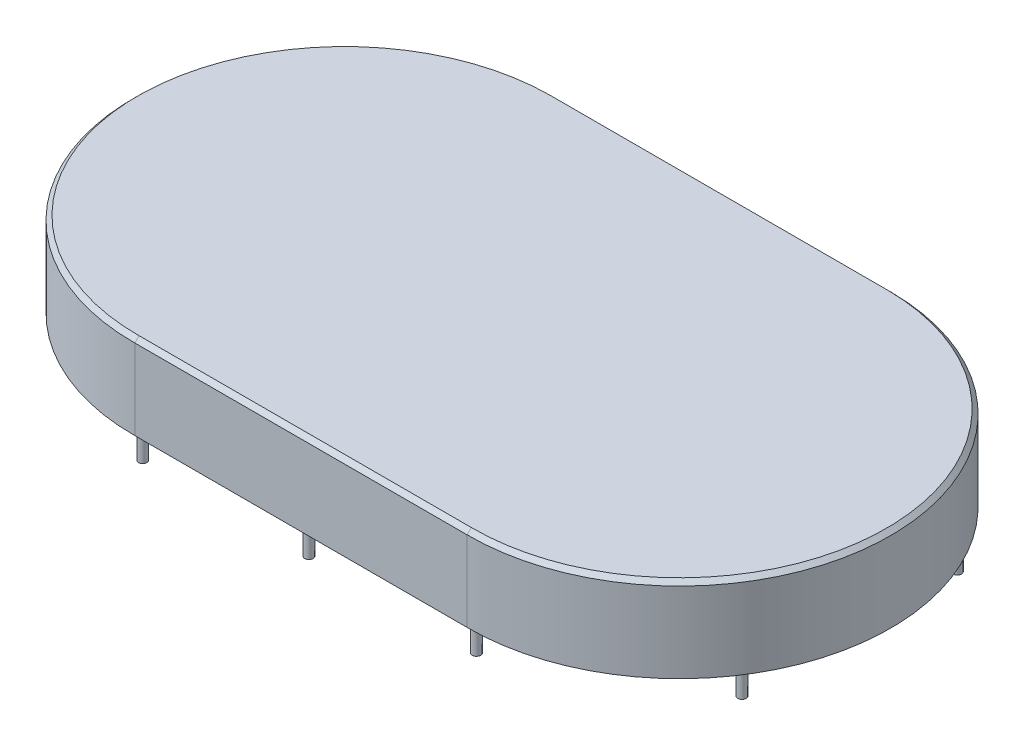
ISO-10303-21;
HEADER;
FILE_DESCRIPTION(('STEP AP214'),'2;1');
FILE_NAME('part.step','',(''),(''),'','','');
FILE_SCHEMA(('AUTOMOTIVE_DESIGN { 1 0 10303 214 1 1 1 1 }'));
ENDSEC;
DATA;
#1=APPLICATION_CONTEXT('core data for automotive mechanical design processes');
#2=APPLICATION_PROTOCOL_DEFINITION('international standard','automotive_design',2000,#1);
#3=PRODUCT_CONTEXT('',#1,'mechanical');
#4=PRODUCT('Part','Part','',(#3));
#5=PRODUCT_RELATED_PRODUCT_CATEGORY('part','',(#4));
#6=PRODUCT_DEFINITION_FORMATION('','',#4);
#7=PRODUCT_DEFINITION_CONTEXT('part definition',#1,'design');
#8=PRODUCT_DEFINITION('design','',#6,#7);
#9=PRODUCT_DEFINITION_SHAPE('','',#8);
#10=(LENGTH_UNIT() NAMED_UNIT(*) SI_UNIT(.MILLI.,.METRE.));
#11=(NAMED_UNIT(*) PLANE_ANGLE_UNIT() SI_UNIT($,.RADIAN.));
#12=(NAMED_UNIT(*) SI_UNIT($,.STERADIAN.) SOLID_ANGLE_UNIT());
#13=UNCERTAINTY_MEASURE_WITH_UNIT(LENGTH_MEASURE(1.E-05),#10,'distance_accuracy_value','');
#14=(GEOMETRIC_REPRESENTATION_CONTEXT(3) GLOBAL_UNCERTAINTY_ASSIGNED_CONTEXT((#13)) GLOBAL_UNIT_ASSIGNED_CONTEXT((#10,
#11,#12)) REPRESENTATION_CONTEXT('',''));
#15=CARTESIAN_POINT('',(0.,0.,0.));
#16=DIRECTION('',(0.,0.,1.));
#17=DIRECTION('',(1.,0.,0.));
#18=AXIS2_PLACEMENT_3D('',#15,#16,#17);
#19=CARTESIAN_POINT('',(39.6881770234131,-20.,0.));
#20=DIRECTION('',(0.,-1.,0.));
#21=DIRECTION('',(0.,0.,-1.));
#22=AXIS2_PLACEMENT_3D('',#19,#20,#21);
#23=PLANE('',#22);
#24=CARTESIAN_POINT('',(39.688177023413,-20.,-48.1069584869996));
#25=DIRECTION('',(0.,-1.,0.));
#26=DIRECTION('',(0.,0.,1.));
#27=AXIS2_PLACEMENT_3D('',#24,#25,#26);
#28=CIRCLE('',#27,0.999999999999998);
#29=CARTESIAN_POINT('',(39.688177023413,-20.,-47.1069584869996));
#30=VERTEX_POINT('',#29);
#31=EDGE_CURVE('E596',#30,#30,#28,.T.);
#32=ORIENTED_EDGE('',*,*,#31,.F.);
#33=EDGE_LOOP('',(#32));
#34=FACE_BOUND('',#33,.T.);
#35=CARTESIAN_POINT('',(-39.3729084256068,-20.,-48.1069584869996));
#36=DIRECTION('',(0.,-1.,0.));
#37=DIRECTION('',(0.,0.,1.));
#38=AXIS2_PLACEMENT_3D('',#35,#36,#37);
#39=CIRCLE('',#38,0.999999999999998);
#40=CARTESIAN_POINT('',(-39.3729084256068,-20.,-47.1069584869996));
#41=VERTEX_POINT('',#40);
#42=EDGE_CURVE('E595',#41,#41,#39,.T.);
#43=ORIENTED_EDGE('',*,*,#42,.F.);
#44=EDGE_LOOP('',(#43));
#45=FACE_BOUND('',#44,.T.);
#46=CARTESIAN_POINT('',(0.,-20.,-48.1069584869996));
#47=DIRECTION('',(0.,-1.,0.));
#48=DIRECTION('',(0.,0.,1.));
#49=AXIS2_PLACEMENT_3D('',#46,#47,#48);
#50=CIRCLE('',#49,1.);
#51=CARTESIAN_POINT('',(0.,-20.,-47.1069584869996));
#52=VERTEX_POINT('',#51);
#53=EDGE_CURVE('E605',#52,#52,#50,.T.);
#54=ORIENTED_EDGE('',*,*,#53,.F.);
#55=EDGE_LOOP('',(#54));
#56=FACE_BOUND('',#55,.T.);
#57=CARTESIAN_POINT('',(39.688177023413,-20.,48.1069584869996));
#58=DIRECTION('',(0.,-1.,0.));
#59=DIRECTION('',(0.,0.,-1.));
#60=AXIS2_PLACEMENT_3D('',#57,#58,#59);
#61=CIRCLE('',#60,0.999999999999998);
#62=CARTESIAN_POINT('',(39.688177023413,-20.,47.1069584869996));
#63=VERTEX_POINT('',#62);
#64=EDGE_CURVE('E610',#63,#63,#61,.T.);
#65=ORIENTED_EDGE('',*,*,#64,.F.);
#66=EDGE_LOOP('',(#65));
#67=FACE_BOUND('',#66,.T.);
#68=CARTESIAN_POINT('',(0.,-20.,48.1069584869996));
#69=DIRECTION('',(0.,-1.,0.));
#70=DIRECTION('',(0.,0.,-1.));
#71=AXIS2_PLACEMENT_3D('',#68,#69,#70);
#72=CIRCLE('',#71,1.);
#73=CARTESIAN_POINT('',(0.,-20.,47.1069584869996));
#74=VERTEX_POINT('',#73);
#75=EDGE_CURVE('E616',#74,#74,#72,.T.);
#76=ORIENTED_EDGE('',*,*,#75,.F.);
#77=EDGE_LOOP('',(#76));
#78=FACE_BOUND('',#77,.T.);
#79=CARTESIAN_POINT('',(-39.3729084256068,-20.,48.1069584869996));
#80=DIRECTION('',(0.,-1.,0.));
#81=DIRECTION('',(0.,0.,-1.));
#82=AXIS2_PLACEMENT_3D('',#79,#80,#81);
#83=CIRCLE('',#82,0.999999999999998);
#84=CARTESIAN_POINT('',(-39.3729084256068,-20.,47.1069584869996));
#85=VERTEX_POINT('',#84);
#86=EDGE_CURVE('E622',#85,#85,#83,.T.);
#87=ORIENTED_EDGE('',*,*,#86,.F.);
#88=EDGE_LOOP('',(#87));
#89=FACE_BOUND('',#88,.T.);
#90=CARTESIAN_POINT('',(79.9745896823286,-20.,25.5));
#91=DIRECTION('',(0.,-1.,0.));
#92=DIRECTION('',(0.,0.,-1.));
#93=AXIS2_PLACEMENT_3D('',#90,#91,#92);
#94=CIRCLE('',#93,0.999999999999998);
#95=CARTESIAN_POINT('',(79.9745896823286,-20.,24.5));
#96=VERTEX_POINT('',#95);
#97=EDGE_CURVE('E628',#96,#96,#94,.T.);
#98=ORIENTED_EDGE('',*,*,#97,.F.);
#99=EDGE_LOOP('',(#98));
#100=FACE_BOUND('',#99,.T.);
#101=CARTESIAN_POINT('',(-87.6892573834301,-20.,0.));
#102=DIRECTION('',(0.,-1.,0.));
#103=DIRECTION('',(0.,0.,-1.));
#104=AXIS2_PLACEMENT_3D('',#101,#102,#103);
#105=CIRCLE('',#104,0.999999999999998);
#106=CARTESIAN_POINT('',(-87.6892573834301,-20.,-0.999999999999998));
#107=VERTEX_POINT('',#106);
#108=EDGE_CURVE('E634',#107,#107,#105,.T.);
#109=ORIENTED_EDGE('',*,*,#108,.F.);
#110=EDGE_LOOP('',(#109));
#111=FACE_BOUND('',#110,.T.);
#112=CARTESIAN_POINT('',(-79.9745896823283,-20.,25.5));
#113=DIRECTION('',(0.,-1.,0.));
#114=DIRECTION('',(0.,0.,-1.));
#115=AXIS2_PLACEMENT_3D('',#112,#113,#114);
#116=CIRCLE('',#115,0.999999999999998);
#117=CARTESIAN_POINT('',(-79.9745896823283,-20.,24.5));
#118=VERTEX_POINT('',#117);
#119=EDGE_CURVE('E640',#118,#118,#116,.T.);
#120=ORIENTED_EDGE('',*,*,#119,.F.);
#121=EDGE_LOOP('',(#120));
#122=FACE_BOUND('',#121,.T.);
#123=CARTESIAN_POINT('',(-79.9745896823283,-20.,-25.5));
#124=DIRECTION('',(0.,-1.,0.));
#125=DIRECTION('',(0.,0.,1.));
#126=AXIS2_PLACEMENT_3D('',#123,#124,#125);
#127=CIRCLE('',#126,0.999999999999998);
#128=CARTESIAN_POINT('',(-79.9745896823283,-20.,-24.5));
#129=VERTEX_POINT('',#128);
#130=EDGE_CURVE('E646',#129,#129,#127,.T.);
#131=ORIENTED_EDGE('',*,*,#130,.F.);
#132=EDGE_LOOP('',(#131));
#133=FACE_BOUND('',#132,.T.);
#134=CARTESIAN_POINT('',(79.9745896823286,-20.,-25.5));
#135=DIRECTION('',(0.,-1.,0.));
#136=DIRECTION('',(0.,0.,1.));
#137=AXIS2_PLACEMENT_3D('',#134,#135,#136);
#138=CIRCLE('',#137,0.999999999999998);
#139=CARTESIAN_POINT('',(79.9745896823286,-20.,-24.5));
#140=VERTEX_POINT('',#139);
#141=EDGE_CURVE('E652',#140,#140,#138,.T.);
#142=ORIENTED_EDGE('',*,*,#141,.F.);
#143=EDGE_LOOP('',(#142));
#144=FACE_BOUND('',#143,.T.);
#145=CARTESIAN_POINT('',(39.6881770234131,-20.,0.));
#146=DIRECTION('',(0.,1.,0.));
#147=DIRECTION('',(0.,0.,-1.));
#148=AXIS2_PLACEMENT_3D('',#145,#146,#147);
#149=CIRCLE('',#148,50.0010803600172);
#150=CARTESIAN_POINT('',(39.3594869430936,-20.,50.));
#151=VERTEX_POINT('',#150);
#152=CARTESIAN_POINT('',(40.0168671037313,-20.,-50.));
#153=VERTEX_POINT('',#152);
#154=EDGE_CURVE('E169',#151,#153,#149,.T.);
#155=ORIENTED_EDGE('',*,*,#154,.F.);
#156=DIRECTION('',(1.,0.,0.));
#157=VECTOR('',#156,1.);
#158=CARTESIAN_POINT('',(39.3594869430936,-20.,50.));
#159=LINE('',#158,#157);
#160=CARTESIAN_POINT('',(-39.3594869430936,-20.,50.));
#161=VERTEX_POINT('',#160);
#162=EDGE_CURVE('E178',#161,#151,#159,.T.);
#163=ORIENTED_EDGE('',*,*,#162,.F.);
#164=CARTESIAN_POINT('',(-39.6881770234129,-20.,0.));
#165=DIRECTION('',(0.,1.,0.));
#166=DIRECTION('',(0.,0.,1.));
#167=AXIS2_PLACEMENT_3D('',#164,#165,#166);
#168=CIRCLE('',#167,50.0010803600172);
#169=CARTESIAN_POINT('',(-40.0168671037321,-20.,-50.));
#170=VERTEX_POINT('',#169);
#171=EDGE_CURVE('E175',#170,#161,#168,.T.);
#172=ORIENTED_EDGE('',*,*,#171,.F.);
#173=DIRECTION('',(-1.,0.,0.));
#174=VECTOR('',#173,1.);
#175=CARTESIAN_POINT('',(-40.0168671037321,-20.,-50.));
#176=LINE('',#175,#174);
#177=EDGE_CURVE('E172',#153,#170,#176,.T.);
#178=ORIENTED_EDGE('',*,*,#177,.F.);
#179=EDGE_LOOP('',(#155,#163,#172,#178));
#180=FACE_BOUND('',#179,.T.);
#181=DIRECTION('',(1.,0.,0.));
#182=VECTOR('',#181,1.);
#183=CARTESIAN_POINT('',(39.3594869430936,-20.,46.));
#184=LINE('',#183,#182);
#185=CARTESIAN_POINT('',(-39.3729084256066,-20.,46.));
#186=VERTEX_POINT('',#185);
#187=CARTESIAN_POINT('',(39.3729084256087,-20.,46.));
#188=VERTEX_POINT('',#187);
#189=EDGE_CURVE('E125',#186,#188,#184,.T.);
#190=ORIENTED_EDGE('',*,*,#189,.T.);
#191=CARTESIAN_POINT('',(39.6881770234131,-20.,0.));
#192=DIRECTION('',(0.,-1.,0.));
#193=DIRECTION('',(0.,0.,-1.));
#194=AXIS2_PLACEMENT_3D('',#191,#192,#193);
#195=CIRCLE('',#194,46.0010803600172);
#196=CARTESIAN_POINT('',(40.0034456212174,-20.,-46.));
#197=VERTEX_POINT('',#196);
#198=EDGE_CURVE('E134',#188,#197,#195,.F.);
#199=ORIENTED_EDGE('',*,*,#198,.T.);
#200=DIRECTION('',(-1.,0.,0.));
#201=VECTOR('',#200,1.);
#202=CARTESIAN_POINT('',(-40.0168671037321,-20.,-46.));
#203=LINE('',#202,#201);
#204=CARTESIAN_POINT('',(-40.0034456212192,-20.,-46.));
#205=VERTEX_POINT('',#204);
#206=EDGE_CURVE('E141',#197,#205,#203,.T.);
#207=ORIENTED_EDGE('',*,*,#206,.T.);
#208=CARTESIAN_POINT('',(-39.6881770234129,-20.,0.));
#209=DIRECTION('',(0.,-1.,0.));
#210=DIRECTION('',(0.,0.,-1.));
#211=AXIS2_PLACEMENT_3D('',#208,#209,#210);
#212=CIRCLE('',#211,46.0010803600172);
#213=EDGE_CURVE('E58',#205,#186,#212,.F.);
#214=ORIENTED_EDGE('',*,*,#213,.T.);
#215=EDGE_LOOP('',(#190,#199,#207,#214));
#216=FACE_BOUND('',#215,.T.);
#217=ADVANCED_FACE('F35',(#34,#45,#56,#67,#78,#89,#100,#111,#122,#133,#144,#180,#216),#23,.T.);
#218=CARTESIAN_POINT('',(39.6881770234131,-20.,0.));
#219=DIRECTION('',(0.,1.,0.));
#220=DIRECTION('',(0.,0.,1.));
#221=AXIS2_PLACEMENT_3D('',#218,#219,#220);
#222=CYLINDRICAL_SURFACE('',#221,50.0010803600172);
#223=DIRECTION('',(0.,1.,0.));
#224=VECTOR('',#223,1.);
#225=CARTESIAN_POINT('',(40.0168671037313,-20.,-50.));
#226=LINE('',#225,#224);
#227=CARTESIAN_POINT('',(40.0168671037313,-1.00000000000004,-50.));
#228=VERTEX_POINT('',#227);
#229=EDGE_CURVE('E181',#153,#228,#226,.T.);
#230=ORIENTED_EDGE('',*,*,#229,.T.);
#231=CARTESIAN_POINT('',(39.6881770234131,-1.00000000000004,0.));
#232=DIRECTION('',(0.,-1.,0.));
#233=DIRECTION('',(0.,0.,-1.));
#234=AXIS2_PLACEMENT_3D('',#231,#232,#233);
#235=CIRCLE('',#234,50.0010803600172);
#236=CARTESIAN_POINT('',(39.3594869430936,-1.00000000000004,50.));
#237=VERTEX_POINT('',#236);
#238=EDGE_CURVE('E11',#228,#237,#235,.T.);
#239=ORIENTED_EDGE('',*,*,#238,.T.);
#240=DIRECTION('',(0.,1.,0.));
#241=VECTOR('',#240,1.);
#242=CARTESIAN_POINT('',(39.3594869430936,-20.,50.));
#243=LINE('',#242,#241);
#244=EDGE_CURVE('E182',#151,#237,#243,.T.);
#245=ORIENTED_EDGE('',*,*,#244,.F.);
#246=ORIENTED_EDGE('',*,*,#154,.T.);
#247=EDGE_LOOP('',(#230,#239,#245,#246));
#248=FACE_BOUND('',#247,.T.);
#249=ADVANCED_FACE('F262',(#248),#222,.T.);
#250=CARTESIAN_POINT('',(39.3594869430936,-20.,50.));
#251=DIRECTION('',(0.,0.,1.));
#252=DIRECTION('',(1.,0.,0.));
#253=AXIS2_PLACEMENT_3D('',#250,#251,#252);
#254=PLANE('',#253);
#255=ORIENTED_EDGE('',*,*,#244,.T.);
#256=DIRECTION('',(-1.,0.,0.));
#257=VECTOR('',#256,1.);
#258=CARTESIAN_POINT('',(-39.3594869430936,-1.00000000000004,50.));
#259=LINE('',#258,#257);
#260=CARTESIAN_POINT('',(-39.3594869430936,-1.00000000000004,50.));
#261=VERTEX_POINT('',#260);
#262=EDGE_CURVE('E200',#237,#261,#259,.T.);
#263=ORIENTED_EDGE('',*,*,#262,.T.);
#264=DIRECTION('',(0.,1.,0.));
#265=VECTOR('',#264,1.);
#266=CARTESIAN_POINT('',(-39.3594869430936,-20.,50.));
#267=LINE('',#266,#265);
#268=EDGE_CURVE('E186',#161,#261,#267,.T.);
#269=ORIENTED_EDGE('',*,*,#268,.F.);
#270=ORIENTED_EDGE('',*,*,#162,.T.);
#271=EDGE_LOOP('',(#255,#263,#269,#270));
#272=FACE_BOUND('',#271,.T.);
#273=ADVANCED_FACE('F254',(#272),#254,.T.);
#274=CARTESIAN_POINT('',(-39.6881770234129,-20.,0.));
#275=DIRECTION('',(0.,1.,0.));
#276=DIRECTION('',(0.,0.,1.));
#277=AXIS2_PLACEMENT_3D('',#274,#275,#276);
#278=CYLINDRICAL_SURFACE('',#277,50.0010803600172);
#279=ORIENTED_EDGE('',*,*,#268,.T.);
#280=CARTESIAN_POINT('',(-39.6881770234129,-1.00000000000004,0.));
#281=DIRECTION('',(0.,-1.,0.));
#282=DIRECTION('',(0.,0.,-1.));
#283=AXIS2_PLACEMENT_3D('',#280,#281,#282);
#284=CIRCLE('',#283,50.0010803600172);
#285=CARTESIAN_POINT('',(-40.0168671037321,-1.00000000000004,-50.));
#286=VERTEX_POINT('',#285);
#287=EDGE_CURVE('E203',#261,#286,#284,.T.);
#288=ORIENTED_EDGE('',*,*,#287,.T.);
#289=DIRECTION('',(0.,1.,0.));
#290=VECTOR('',#289,1.);
#291=CARTESIAN_POINT('',(-40.0168671037321,-20.,-50.));
#292=LINE('',#291,#290);
#293=EDGE_CURVE('E189',#170,#286,#292,.T.);
#294=ORIENTED_EDGE('',*,*,#293,.F.);
#295=ORIENTED_EDGE('',*,*,#171,.T.);
#296=EDGE_LOOP('',(#279,#288,#294,#295));
#297=FACE_BOUND('',#296,.T.);
#298=ADVANCED_FACE('F255',(#297),#278,.T.);
#299=CARTESIAN_POINT('',(-40.0168671037321,-20.,-50.));
#300=DIRECTION('',(0.,0.,-1.));
#301=DIRECTION('',(-1.,0.,0.));
#302=AXIS2_PLACEMENT_3D('',#299,#300,#301);
#303=PLANE('',#302);
#304=ORIENTED_EDGE('',*,*,#293,.T.);
#305=DIRECTION('',(1.,0.,0.));
#306=VECTOR('',#305,1.);
#307=CARTESIAN_POINT('',(40.0168671037313,-1.00000000000004,-50.));
#308=LINE('',#307,#306);
#309=EDGE_CURVE('E50',#286,#228,#308,.T.);
#310=ORIENTED_EDGE('',*,*,#309,.T.);
#311=ORIENTED_EDGE('',*,*,#229,.F.);
#312=ORIENTED_EDGE('',*,*,#177,.T.);
#313=EDGE_LOOP('',(#304,#310,#311,#312));
#314=FACE_BOUND('',#313,.T.);
#315=ADVANCED_FACE('F272',(#314),#303,.T.);
#316=CARTESIAN_POINT('',(39.6881770234131,0.,0.));
#317=DIRECTION('',(0.,-1.,0.));
#318=DIRECTION('',(0.,0.,-1.));
#319=AXIS2_PLACEMENT_3D('',#316,#317,#318);
#320=PLANE('',#319);
#321=CARTESIAN_POINT('',(-39.6881770234129,0.,0.));
#322=DIRECTION('',(0.,-1.,0.));
#323=DIRECTION('',(0.,0.,-1.));
#324=AXIS2_PLACEMENT_3D('',#321,#322,#323);
#325=CIRCLE('',#324,49.0010803600172);
#326=CARTESIAN_POINT('',(-40.0135636378658,0.,-49.));
#327=VERTEX_POINT('',#326);
#328=CARTESIAN_POINT('',(-39.36279040896,0.,49.));
#329=VERTEX_POINT('',#328);
#330=EDGE_CURVE('E195',#327,#329,#325,.F.);
#331=ORIENTED_EDGE('',*,*,#330,.T.);
#332=DIRECTION('',(1.,0.,0.));
#333=VECTOR('',#332,1.);
#334=CARTESIAN_POINT('',(39.3594869430936,0.,49.));
#335=LINE('',#334,#333);
#336=CARTESIAN_POINT('',(39.3627904089621,0.,49.));
#337=VERTEX_POINT('',#336);
#338=EDGE_CURVE('E197',#329,#337,#335,.T.);
#339=ORIENTED_EDGE('',*,*,#338,.T.);
#340=CARTESIAN_POINT('',(39.6881770234131,0.,0.));
#341=DIRECTION('',(0.,-1.,0.));
#342=DIRECTION('',(0.,0.,-1.));
#343=AXIS2_PLACEMENT_3D('',#340,#341,#342);
#344=CIRCLE('',#343,49.0010803600172);
#345=CARTESIAN_POINT('',(40.013563637865,0.,-49.));
#346=VERTEX_POINT('',#345);
#347=EDGE_CURVE('E185',#337,#346,#344,.F.);
#348=ORIENTED_EDGE('',*,*,#347,.T.);
#349=DIRECTION('',(-1.,0.,0.));
#350=VECTOR('',#349,1.);
#351=CARTESIAN_POINT('',(-40.0168671037321,0.,-49.));
#352=LINE('',#351,#350);
#353=EDGE_CURVE('E193',#346,#327,#352,.T.);
#354=ORIENTED_EDGE('',*,*,#353,.T.);
#355=EDGE_LOOP('',(#331,#339,#348,#354));
#356=FACE_BOUND('',#355,.T.);
#357=ADVANCED_FACE('F265',(#356),#320,.F.);
#358=CARTESIAN_POINT('',(39.6881770234131,0.,-49.));
#359=DIRECTION('',(0.,0.707106781186543,-0.707106781186552));
#360=DIRECTION('',(1.,0.,0.));
#361=AXIS2_PLACEMENT_3D('',#358,#359,#360);
#362=PLANE('',#361);
#363=CARTESIAN_POINT('',(40.0168671037313,-1.00000000000004,-50.));
#364=CARTESIAN_POINT('',(40.0163193068082,-0.833333328740418,-49.8333333287404));
#365=CARTESIAN_POINT('',(40.0157701195245,-0.666666659777299,-49.6666666597773));
#366=CARTESIAN_POINT('',(40.0146689642358,-0.333333326443952,-49.3333333264439));
#367=CARTESIAN_POINT('',(40.0141169962309,-0.166666662073725,-49.1666666620737));
#368=CARTESIAN_POINT('',(40.0135636378654,0.,-49.));
#369=B_SPLINE_CURVE_WITH_KNOTS('',3,(#363,#364,#365,#366,#367,#368),.UNSPECIFIED.,.F.,.F.,(4,2,
4),(0.,0.707108710340045,1.41421742068059),.UNSPECIFIED.);
#370=EDGE_CURVE('E233',#228,#346,#369,.T.);
#371=ORIENTED_EDGE('',*,*,#370,.F.);
#372=ORIENTED_EDGE('',*,*,#309,.F.);
#373=CARTESIAN_POINT('',(-40.0168671037321,-1.00000000000004,-50.));
#374=CARTESIAN_POINT('',(-40.0163193068085,-0.833333328740419,-49.8333333287404));
#375=CARTESIAN_POINT('',(-40.0157701195244,-0.6666666597773,-49.6666666597773));
#376=CARTESIAN_POINT('',(-40.0146689642354,-0.333333326443953,-49.3333333264439));
#377=CARTESIAN_POINT('',(-40.0141169962305,-0.166666662073726,-49.1666666620737));
#378=CARTESIAN_POINT('',(-40.0135636378651,0.,-49.));
#379=B_SPLINE_CURVE_WITH_KNOTS('',3,(#373,#374,#375,#376,#377,#378),.UNSPECIFIED.,.F.,.F.,(4,2,
4),(0.,0.707108710340047,1.41421742068059),.UNSPECIFIED.);
#380=EDGE_CURVE('E41',#327,#286,#379,.F.);
#381=ORIENTED_EDGE('',*,*,#380,.F.);
#382=ORIENTED_EDGE('',*,*,#353,.F.);
#383=EDGE_LOOP('',(#371,#372,#381,#382));
#384=FACE_BOUND('',#383,.T.);
#385=ADVANCED_FACE('F38',(#384),#362,.T.);
#386=CARTESIAN_POINT('',(-39.6881770234129,0.,0.));
#387=DIRECTION('',(0.,-1.,0.));
#388=DIRECTION('',(0.,0.,-1.));
#389=AXIS2_PLACEMENT_3D('',#386,#387,#388);
#390=CONICAL_SURFACE('',#389,49.0010803600172,0.785398163397445);
#391=ORIENTED_EDGE('',*,*,#380,.T.);
#392=ORIENTED_EDGE('',*,*,#287,.F.);
#393=CARTESIAN_POINT('',(-39.3594869430936,-1.00000000000004,50.));
#394=CARTESIAN_POINT('',(-39.3600347400173,-0.833333328740419,49.8333333287404));
#395=CARTESIAN_POINT('',(-39.3605839273013,-0.6666666597773,49.6666666597773));
#396=CARTESIAN_POINT('',(-39.3616850825903,-0.333333326443953,49.3333333264439));
#397=CARTESIAN_POINT('',(-39.3622370505953,-0.166666662073726,49.1666666620737));
#398=CARTESIAN_POINT('',(-39.3627904089606,0.,49.));
#399=B_SPLINE_CURVE_WITH_KNOTS('',3,(#393,#394,#395,#396,#397,#398),.UNSPECIFIED.,.F.,.F.,(4,2,
4),(0.,0.707108710340047,1.41421742068059),.UNSPECIFIED.);
#400=EDGE_CURVE('E213',#329,#261,#399,.F.);
#401=ORIENTED_EDGE('',*,*,#400,.F.);
#402=ORIENTED_EDGE('',*,*,#330,.F.);
#403=EDGE_LOOP('',(#391,#392,#401,#402));
#404=FACE_BOUND('',#403,.T.);
#405=ADVANCED_FACE('F229',(#404),#390,.T.);
#406=CARTESIAN_POINT('',(39.6881770234131,0.,0.));
#407=DIRECTION('',(0.,-1.,0.));
#408=DIRECTION('',(0.,0.,-1.));
#409=AXIS2_PLACEMENT_3D('',#406,#407,#408);
#410=CONICAL_SURFACE('',#409,49.0010803600172,0.785398163397441);
#411=ORIENTED_EDGE('',*,*,#370,.T.);
#412=ORIENTED_EDGE('',*,*,#347,.F.);
#413=CARTESIAN_POINT('',(39.3627904089621,0.,49.));
#414=CARTESIAN_POINT('',(39.3622370505963,-0.166666662073722,49.1666666620737));
#415=CARTESIAN_POINT('',(39.3616850825911,-0.333333326443948,49.3333333264439));
#416=CARTESIAN_POINT('',(39.3605839273019,-0.666666659777295,49.6666666597772));
#417=CARTESIAN_POINT('',(39.3600347400179,-0.833333328740414,49.8333333287404));
#418=CARTESIAN_POINT('',(39.3594869430946,-1.00000000000004,50.));
#419=B_SPLINE_CURVE_WITH_KNOTS('',3,(#413,#414,#415,#416,#417,#418),.UNSPECIFIED.,.F.,.F.,(4,2,
4),(0.,0.707108710340538,1.41421742068059),.UNSPECIFIED.);
#420=EDGE_CURVE('E168',#237,#337,#419,.F.);
#421=ORIENTED_EDGE('',*,*,#420,.F.);
#422=ORIENTED_EDGE('',*,*,#238,.F.);
#423=EDGE_LOOP('',(#411,#412,#421,#422));
#424=FACE_BOUND('',#423,.T.);
#425=ADVANCED_FACE('F223',(#424),#410,.T.);
#426=CARTESIAN_POINT('',(39.6881770234131,0.,49.));
#427=DIRECTION('',(0.,0.707106781186543,0.707106781186552));
#428=DIRECTION('',(-1.,0.,0.));
#429=AXIS2_PLACEMENT_3D('',#426,#427,#428);
#430=PLANE('',#429);
#431=ORIENTED_EDGE('',*,*,#400,.T.);
#432=ORIENTED_EDGE('',*,*,#262,.F.);
#433=ORIENTED_EDGE('',*,*,#420,.T.);
#434=ORIENTED_EDGE('',*,*,#338,.F.);
#435=EDGE_LOOP('',(#431,#432,#433,#434));
#436=FACE_BOUND('',#435,.T.);
#437=ADVANCED_FACE('F219',(#436),#430,.T.);
#438=CARTESIAN_POINT('',(39.6881770234131,-20.,0.));
#439=DIRECTION('',(0.,1.,0.));
#440=DIRECTION('',(0.,0.,1.));
#441=AXIS2_PLACEMENT_3D('',#438,#439,#440);
#442=CYLINDRICAL_SURFACE('',#441,46.0010803600172);
#443=DIRECTION('',(0.,1.,0.));
#444=VECTOR('',#443,1.);
#445=CARTESIAN_POINT('',(40.0034456212171,-20.,-46.));
#446=LINE('',#445,#444);
#447=CARTESIAN_POINT('',(40.0034456212171,-4.,-46.));
#448=VERTEX_POINT('',#447);
#449=EDGE_CURVE('E137',#197,#448,#446,.T.);
#450=ORIENTED_EDGE('',*,*,#449,.F.);
#451=ORIENTED_EDGE('',*,*,#198,.F.);
#452=DIRECTION('',(0.,1.,0.));
#453=VECTOR('',#452,1.);
#454=CARTESIAN_POINT('',(39.3729084256091,-20.,46.));
#455=LINE('',#454,#453);
#456=CARTESIAN_POINT('',(39.3729084256091,-4.,46.));
#457=VERTEX_POINT('',#456);
#458=EDGE_CURVE('E120',#188,#457,#455,.T.);
#459=ORIENTED_EDGE('',*,*,#458,.T.);
#460=CARTESIAN_POINT('',(39.6881770234131,-4.,0.));
#461=DIRECTION('',(0.,-1.,0.));
#462=DIRECTION('',(0.,0.,-1.));
#463=AXIS2_PLACEMENT_3D('',#460,#461,#462);
#464=CIRCLE('',#463,46.0010803600172);
#465=EDGE_CURVE('E166',#448,#457,#464,.T.);
#466=ORIENTED_EDGE('',*,*,#465,.F.);
#467=EDGE_LOOP('',(#450,#451,#459,#466));
#468=FACE_BOUND('',#467,.T.);
#469=ADVANCED_FACE('F135',(#468),#442,.F.);
#470=CARTESIAN_POINT('',(39.3594869430936,-20.,46.));
#471=DIRECTION('',(0.,0.,1.));
#472=DIRECTION('',(1.,0.,0.));
#473=AXIS2_PLACEMENT_3D('',#470,#471,#472);
#474=PLANE('',#473);
#475=ORIENTED_EDGE('',*,*,#458,.F.);
#476=ORIENTED_EDGE('',*,*,#189,.F.);
#477=DIRECTION('',(0.,1.,0.));
#478=VECTOR('',#477,1.);
#479=CARTESIAN_POINT('',(-39.3729084256068,-20.,46.));
#480=LINE('',#479,#478);
#481=CARTESIAN_POINT('',(-39.3729084256068,-4.,46.));
#482=VERTEX_POINT('',#481);
#483=EDGE_CURVE('E131',#186,#482,#480,.T.);
#484=ORIENTED_EDGE('',*,*,#483,.T.);
#485=DIRECTION('',(-1.,0.,0.));
#486=VECTOR('',#485,1.);
#487=CARTESIAN_POINT('',(39.6881770234131,-4.,46.));
#488=LINE('',#487,#486);
#489=EDGE_CURVE('E127',#457,#482,#488,.T.);
#490=ORIENTED_EDGE('',*,*,#489,.F.);
#491=EDGE_LOOP('',(#475,#476,#484,#490));
#492=FACE_BOUND('',#491,.T.);
#493=ADVANCED_FACE('F122',(#492),#474,.F.);
#494=CARTESIAN_POINT('',(-39.6881770234129,-20.,0.));
#495=DIRECTION('',(0.,1.,0.));
#496=DIRECTION('',(0.,0.,1.));
#497=AXIS2_PLACEMENT_3D('',#494,#495,#496);
#498=CYLINDRICAL_SURFACE('',#497,46.0010803600172);
#499=ORIENTED_EDGE('',*,*,#483,.F.);
#500=ORIENTED_EDGE('',*,*,#213,.F.);
#501=DIRECTION('',(0.,1.,0.));
#502=VECTOR('',#501,1.);
#503=CARTESIAN_POINT('',(-40.0034456212189,-20.,-46.));
#504=LINE('',#503,#502);
#505=CARTESIAN_POINT('',(-40.0034456212189,-4.,-46.));
#506=VERTEX_POINT('',#505);
#507=EDGE_CURVE('E145',#205,#506,#504,.T.);
#508=ORIENTED_EDGE('',*,*,#507,.T.);
#509=CARTESIAN_POINT('',(-39.6881770234129,-4.,0.));
#510=DIRECTION('',(0.,-1.,0.));
#511=DIRECTION('',(0.,0.,-1.));
#512=AXIS2_PLACEMENT_3D('',#509,#510,#511);
#513=CIRCLE('',#512,46.0010803600172);
#514=EDGE_CURVE('E163',#482,#506,#513,.T.);
#515=ORIENTED_EDGE('',*,*,#514,.F.);
#516=EDGE_LOOP('',(#499,#500,#508,#515));
#517=FACE_BOUND('',#516,.T.);
#518=ADVANCED_FACE('F340',(#517),#498,.F.);
#519=CARTESIAN_POINT('',(-40.0168671037321,-20.,-46.));
#520=DIRECTION('',(0.,0.,-1.));
#521=DIRECTION('',(-1.,0.,0.));
#522=AXIS2_PLACEMENT_3D('',#519,#520,#521);
#523=PLANE('',#522);
#524=DIRECTION('',(-1.,0.,0.));
#525=VECTOR('',#524,1.);
#526=CARTESIAN_POINT('',(-40.0168671037321,-4.,-46.));
#527=LINE('',#526,#525);
#528=EDGE_CURVE('E130',#448,#506,#527,.T.);
#529=ORIENTED_EDGE('',*,*,#528,.T.);
#530=ORIENTED_EDGE('',*,*,#507,.F.);
#531=ORIENTED_EDGE('',*,*,#206,.F.);
#532=ORIENTED_EDGE('',*,*,#449,.T.);
#533=EDGE_LOOP('',(#529,#530,#531,#532));
#534=FACE_BOUND('',#533,.T.);
#535=ADVANCED_FACE('F349',(#534),#523,.F.);
#536=CARTESIAN_POINT('',(39.6881770234131,-4.,0.));
#537=DIRECTION('',(0.,-1.,0.));
#538=DIRECTION('',(0.,0.,-1.));
#539=AXIS2_PLACEMENT_3D('',#536,#537,#538);
#540=PLANE('',#539);
#541=ORIENTED_EDGE('',*,*,#465,.T.);
#542=ORIENTED_EDGE('',*,*,#489,.T.);
#543=ORIENTED_EDGE('',*,*,#514,.T.);
#544=ORIENTED_EDGE('',*,*,#528,.F.);
#545=EDGE_LOOP('',(#541,#542,#543,#544));
#546=FACE_BOUND('',#545,.T.);
#547=ADVANCED_FACE('F283',(#546),#540,.T.);
#548=CARTESIAN_POINT('',(79.9745896823286,-26.,-25.5));
#549=DIRECTION('',(0.,1.,0.));
#550=DIRECTION('',(0.,0.,1.));
#551=AXIS2_PLACEMENT_3D('',#548,#549,#550);
#552=CYLINDRICAL_SURFACE('',#551,0.999999999999998);
#553=CARTESIAN_POINT('',(79.9745896823286,-26.,-25.5));
#554=DIRECTION('',(0.,-1.,0.));
#555=DIRECTION('',(0.,0.,1.));
#556=AXIS2_PLACEMENT_3D('',#553,#554,#555);
#557=CIRCLE('',#556,0.999999999999998);
#558=CARTESIAN_POINT('',(79.9745896823286,-26.,-24.5));
#559=VERTEX_POINT('',#558);
#560=EDGE_CURVE('E142',#559,#559,#557,.T.);
#561=ORIENTED_EDGE('',*,*,#560,.F.);
#562=EDGE_LOOP('',(#561));
#563=FACE_BOUND('',#562,.T.);
#564=ORIENTED_EDGE('',*,*,#141,.T.);
#565=EDGE_LOOP('',(#564));
#566=FACE_BOUND('',#565,.T.);
#567=ADVANCED_FACE('F365',(#563,#566),#552,.T.);
#568=CARTESIAN_POINT('',(79.9745896823286,-26.,-25.5));
#569=DIRECTION('',(0.,1.,0.));
#570=DIRECTION('',(0.,0.,1.));
#571=AXIS2_PLACEMENT_3D('',#568,#569,#570);
#572=PLANE('',#571);
#573=ORIENTED_EDGE('',*,*,#560,.T.);
#574=EDGE_LOOP('',(#573));
#575=FACE_BOUND('',#574,.T.);
#576=ADVANCED_FACE('F378',(#575),#572,.F.);
#577=CARTESIAN_POINT('',(-79.9745896823283,-26.,-25.5));
#578=DIRECTION('',(0.,1.,0.));
#579=DIRECTION('',(0.,0.,1.));
#580=AXIS2_PLACEMENT_3D('',#577,#578,#579);
#581=CYLINDRICAL_SURFACE('',#580,0.999999999999998);
#582=CARTESIAN_POINT('',(-79.9745896823283,-26.,-25.5));
#583=DIRECTION('',(0.,-1.,0.));
#584=DIRECTION('',(0.,0.,1.));
#585=AXIS2_PLACEMENT_3D('',#582,#583,#584);
#586=CIRCLE('',#585,0.999999999999998);
#587=CARTESIAN_POINT('',(-79.9745896823283,-26.,-24.5));
#588=VERTEX_POINT('',#587);
#589=EDGE_CURVE('E649',#588,#588,#586,.T.);
#590=ORIENTED_EDGE('',*,*,#589,.F.);
#591=EDGE_LOOP('',(#590));
#592=FACE_BOUND('',#591,.T.);
#593=ORIENTED_EDGE('',*,*,#130,.T.);
#594=EDGE_LOOP('',(#593));
#595=FACE_BOUND('',#594,.T.);
#596=ADVANCED_FACE('F388',(#592,#595),#581,.T.);
#597=CARTESIAN_POINT('',(-79.9745896823283,-26.,-25.5));
#598=DIRECTION('',(0.,1.,0.));
#599=DIRECTION('',(0.,0.,1.));
#600=AXIS2_PLACEMENT_3D('',#597,#598,#599);
#601=PLANE('',#600);
#602=ORIENTED_EDGE('',*,*,#589,.T.);
#603=EDGE_LOOP('',(#602));
#604=FACE_BOUND('',#603,.T.);
#605=ADVANCED_FACE('F398',(#604),#601,.F.);
#606=CARTESIAN_POINT('',(-79.9745896823283,-26.,25.5));
#607=DIRECTION('',(0.,1.,0.));
#608=DIRECTION('',(0.,0.,1.));
#609=AXIS2_PLACEMENT_3D('',#606,#607,#608);
#610=CYLINDRICAL_SURFACE('',#609,0.999999999999998);
#611=CARTESIAN_POINT('',(-79.9745896823283,-26.,25.5));
#612=DIRECTION('',(0.,-1.,0.));
#613=DIRECTION('',(0.,0.,-1.));
#614=AXIS2_PLACEMENT_3D('',#611,#612,#613);
#615=CIRCLE('',#614,0.999999999999998);
#616=CARTESIAN_POINT('',(-79.9745896823283,-26.,24.5));
#617=VERTEX_POINT('',#616);
#618=EDGE_CURVE('E643',#617,#617,#615,.T.);
#619=ORIENTED_EDGE('',*,*,#618,.F.);
#620=EDGE_LOOP('',(#619));
#621=FACE_BOUND('',#620,.T.);
#622=ORIENTED_EDGE('',*,*,#119,.T.);
#623=EDGE_LOOP('',(#622));
#624=FACE_BOUND('',#623,.T.);
#625=ADVANCED_FACE('F408',(#621,#624),#610,.T.);
#626=CARTESIAN_POINT('',(-79.9745896823283,-26.,25.5));
#627=DIRECTION('',(0.,-1.,0.));
#628=DIRECTION('',(0.,0.,-1.));
#629=AXIS2_PLACEMENT_3D('',#626,#627,#628);
#630=PLANE('',#629);
#631=ORIENTED_EDGE('',*,*,#618,.T.);
#632=EDGE_LOOP('',(#631));
#633=FACE_BOUND('',#632,.T.);
#634=ADVANCED_FACE('F418',(#633),#630,.T.);
#635=CARTESIAN_POINT('',(-87.6892573834301,-26.,0.));
#636=DIRECTION('',(0.,1.,0.));
#637=DIRECTION('',(0.,0.,1.));
#638=AXIS2_PLACEMENT_3D('',#635,#636,#637);
#639=CYLINDRICAL_SURFACE('',#638,0.999999999999998);
#640=CARTESIAN_POINT('',(-87.6892573834301,-26.,0.));
#641=DIRECTION('',(0.,-1.,0.));
#642=DIRECTION('',(0.,0.,-1.));
#643=AXIS2_PLACEMENT_3D('',#640,#641,#642);
#644=CIRCLE('',#643,0.999999999999998);
#645=CARTESIAN_POINT('',(-87.6892573834301,-26.,-0.999999999999998));
#646=VERTEX_POINT('',#645);
#647=EDGE_CURVE('E637',#646,#646,#644,.T.);
#648=ORIENTED_EDGE('',*,*,#647,.F.);
#649=EDGE_LOOP('',(#648));
#650=FACE_BOUND('',#649,.T.);
#651=ORIENTED_EDGE('',*,*,#108,.T.);
#652=EDGE_LOOP('',(#651));
#653=FACE_BOUND('',#652,.T.);
#654=ADVANCED_FACE('F428',(#650,#653),#639,.T.);
#655=CARTESIAN_POINT('',(-87.6892573834301,-26.,0.));
#656=DIRECTION('',(0.,-1.,0.));
#657=DIRECTION('',(0.,0.,-1.));
#658=AXIS2_PLACEMENT_3D('',#655,#656,#657);
#659=PLANE('',#658);
#660=ORIENTED_EDGE('',*,*,#647,.T.);
#661=EDGE_LOOP('',(#660));
#662=FACE_BOUND('',#661,.T.);
#663=ADVANCED_FACE('F438',(#662),#659,.T.);
#664=CARTESIAN_POINT('',(79.9745896823286,-26.,25.5));
#665=DIRECTION('',(0.,1.,0.));
#666=DIRECTION('',(0.,0.,1.));
#667=AXIS2_PLACEMENT_3D('',#664,#665,#666);
#668=CYLINDRICAL_SURFACE('',#667,0.999999999999998);
#669=CARTESIAN_POINT('',(79.9745896823286,-26.,25.5));
#670=DIRECTION('',(0.,-1.,0.));
#671=DIRECTION('',(0.,0.,-1.));
#672=AXIS2_PLACEMENT_3D('',#669,#670,#671);
#673=CIRCLE('',#672,0.999999999999998);
#674=CARTESIAN_POINT('',(79.9745896823286,-26.,24.5));
#675=VERTEX_POINT('',#674);
#676=EDGE_CURVE('E631',#675,#675,#673,.T.);
#677=ORIENTED_EDGE('',*,*,#676,.F.);
#678=EDGE_LOOP('',(#677));
#679=FACE_BOUND('',#678,.T.);
#680=ORIENTED_EDGE('',*,*,#97,.T.);
#681=EDGE_LOOP('',(#680));
#682=FACE_BOUND('',#681,.T.);
#683=ADVANCED_FACE('F448',(#679,#682),#668,.T.);
#684=CARTESIAN_POINT('',(79.9745896823286,-26.,25.5));
#685=DIRECTION('',(0.,-1.,0.));
#686=DIRECTION('',(0.,0.,-1.));
#687=AXIS2_PLACEMENT_3D('',#684,#685,#686);
#688=PLANE('',#687);
#689=ORIENTED_EDGE('',*,*,#676,.T.);
#690=EDGE_LOOP('',(#689));
#691=FACE_BOUND('',#690,.T.);
#692=ADVANCED_FACE('F458',(#691),#688,.T.);
#693=CARTESIAN_POINT('',(-39.3729084256068,-26.,48.1069584869996));
#694=DIRECTION('',(0.,1.,0.));
#695=DIRECTION('',(0.,0.,1.));
#696=AXIS2_PLACEMENT_3D('',#693,#694,#695);
#697=CYLINDRICAL_SURFACE('',#696,0.999999999999998);
#698=CARTESIAN_POINT('',(-39.3729084256068,-26.,48.1069584869996));
#699=DIRECTION('',(0.,-1.,0.));
#700=DIRECTION('',(0.,0.,-1.));
#701=AXIS2_PLACEMENT_3D('',#698,#699,#700);
#702=CIRCLE('',#701,0.999999999999998);
#703=CARTESIAN_POINT('',(-39.3729084256068,-26.,47.1069584869996));
#704=VERTEX_POINT('',#703);
#705=EDGE_CURVE('E625',#704,#704,#702,.T.);
#706=ORIENTED_EDGE('',*,*,#705,.F.);
#707=EDGE_LOOP('',(#706));
#708=FACE_BOUND('',#707,.T.);
#709=ORIENTED_EDGE('',*,*,#86,.T.);
#710=EDGE_LOOP('',(#709));
#711=FACE_BOUND('',#710,.T.);
#712=ADVANCED_FACE('F468',(#708,#711),#697,.T.);
#713=CARTESIAN_POINT('',(-39.3729084256068,-26.,48.1069584869996));
#714=DIRECTION('',(0.,-1.,0.));
#715=DIRECTION('',(0.,0.,-1.));
#716=AXIS2_PLACEMENT_3D('',#713,#714,#715);
#717=PLANE('',#716);
#718=ORIENTED_EDGE('',*,*,#705,.T.);
#719=EDGE_LOOP('',(#718));
#720=FACE_BOUND('',#719,.T.);
#721=ADVANCED_FACE('F478',(#720),#717,.T.);
#722=CARTESIAN_POINT('',(0.,-26.,48.1069584869996));
#723=DIRECTION('',(0.,1.,0.));
#724=DIRECTION('',(0.,0.,1.));
#725=AXIS2_PLACEMENT_3D('',#722,#723,#724);
#726=CYLINDRICAL_SURFACE('',#725,1.);
#727=CARTESIAN_POINT('',(0.,-26.,48.1069584869996));
#728=DIRECTION('',(0.,-1.,0.));
#729=DIRECTION('',(0.,0.,-1.));
#730=AXIS2_PLACEMENT_3D('',#727,#728,#729);
#731=CIRCLE('',#730,1.);
#732=CARTESIAN_POINT('',(0.,-26.,47.1069584869996));
#733=VERTEX_POINT('',#732);
#734=EDGE_CURVE('E619',#733,#733,#731,.T.);
#735=ORIENTED_EDGE('',*,*,#734,.F.);
#736=EDGE_LOOP('',(#735));
#737=FACE_BOUND('',#736,.T.);
#738=ORIENTED_EDGE('',*,*,#75,.T.);
#739=EDGE_LOOP('',(#738));
#740=FACE_BOUND('',#739,.T.);
#741=ADVANCED_FACE('F488',(#737,#740),#726,.T.);
#742=CARTESIAN_POINT('',(0.,-26.,48.1069584869996));
#743=DIRECTION('',(0.,-1.,0.));
#744=DIRECTION('',(0.,0.,-1.));
#745=AXIS2_PLACEMENT_3D('',#742,#743,#744);
#746=PLANE('',#745);
#747=ORIENTED_EDGE('',*,*,#734,.T.);
#748=EDGE_LOOP('',(#747));
#749=FACE_BOUND('',#748,.T.);
#750=ADVANCED_FACE('F498',(#749),#746,.T.);
#751=CARTESIAN_POINT('',(39.688177023413,-26.,48.1069584869996));
#752=DIRECTION('',(0.,1.,0.));
#753=DIRECTION('',(0.,0.,1.));
#754=AXIS2_PLACEMENT_3D('',#751,#752,#753);
#755=CYLINDRICAL_SURFACE('',#754,0.999999999999998);
#756=CARTESIAN_POINT('',(39.688177023413,-26.,48.1069584869996));
#757=DIRECTION('',(0.,-1.,0.));
#758=DIRECTION('',(0.,0.,-1.));
#759=AXIS2_PLACEMENT_3D('',#756,#757,#758);
#760=CIRCLE('',#759,0.999999999999998);
#761=CARTESIAN_POINT('',(39.688177023413,-26.,47.1069584869996));
#762=VERTEX_POINT('',#761);
#763=EDGE_CURVE('E613',#762,#762,#760,.T.);
#764=ORIENTED_EDGE('',*,*,#763,.F.);
#765=EDGE_LOOP('',(#764));
#766=FACE_BOUND('',#765,.T.);
#767=ORIENTED_EDGE('',*,*,#64,.T.);
#768=EDGE_LOOP('',(#767));
#769=FACE_BOUND('',#768,.T.);
#770=ADVANCED_FACE('F508',(#766,#769),#755,.T.);
#771=CARTESIAN_POINT('',(39.688177023413,-26.,48.1069584869996));
#772=DIRECTION('',(0.,-1.,0.));
#773=DIRECTION('',(0.,0.,-1.));
#774=AXIS2_PLACEMENT_3D('',#771,#772,#773);
#775=PLANE('',#774);
#776=ORIENTED_EDGE('',*,*,#763,.T.);
#777=EDGE_LOOP('',(#776));
#778=FACE_BOUND('',#777,.T.);
#779=ADVANCED_FACE('F518',(#778),#775,.T.);
#780=CARTESIAN_POINT('',(0.,-26.,-48.1069584869996));
#781=DIRECTION('',(0.,1.,0.));
#782=DIRECTION('',(0.,0.,1.));
#783=AXIS2_PLACEMENT_3D('',#780,#781,#782);
#784=CYLINDRICAL_SURFACE('',#783,1.);
#785=CARTESIAN_POINT('',(0.,-26.,-48.1069584869996));
#786=DIRECTION('',(0.,-1.,0.));
#787=DIRECTION('',(0.,0.,1.));
#788=AXIS2_PLACEMENT_3D('',#785,#786,#787);
#789=CIRCLE('',#788,1.);
#790=CARTESIAN_POINT('',(0.,-26.,-47.1069584869996));
#791=VERTEX_POINT('',#790);
#792=EDGE_CURVE('E607',#791,#791,#789,.T.);
#793=ORIENTED_EDGE('',*,*,#792,.F.);
#794=EDGE_LOOP('',(#793));
#795=FACE_BOUND('',#794,.T.);
#796=ORIENTED_EDGE('',*,*,#53,.T.);
#797=EDGE_LOOP('',(#796));
#798=FACE_BOUND('',#797,.T.);
#799=ADVANCED_FACE('F528',(#795,#798),#784,.T.);
#800=CARTESIAN_POINT('',(0.,-26.,-48.1069584869996));
#801=DIRECTION('',(0.,1.,0.));
#802=DIRECTION('',(0.,0.,1.));
#803=AXIS2_PLACEMENT_3D('',#800,#801,#802);
#804=PLANE('',#803);
#805=ORIENTED_EDGE('',*,*,#792,.T.);
#806=EDGE_LOOP('',(#805));
#807=FACE_BOUND('',#806,.T.);
#808=ADVANCED_FACE('F538',(#807),#804,.F.);
#809=CARTESIAN_POINT('',(-39.3729084256068,-26.,-48.1069584869996));
#810=DIRECTION('',(0.,1.,0.));
#811=DIRECTION('',(0.,0.,1.));
#812=AXIS2_PLACEMENT_3D('',#809,#810,#811);
#813=CYLINDRICAL_SURFACE('',#812,0.999999999999998);
#814=CARTESIAN_POINT('',(-39.3729084256068,-26.,-48.1069584869996));
#815=DIRECTION('',(0.,-1.,0.));
#816=DIRECTION('',(0.,0.,1.));
#817=AXIS2_PLACEMENT_3D('',#814,#815,#816);
#818=CIRCLE('',#817,0.999999999999998);
#819=CARTESIAN_POINT('',(-39.3729084256068,-26.,-47.1069584869996));
#820=VERTEX_POINT('',#819);
#821=EDGE_CURVE('E599',#820,#820,#818,.T.);
#822=ORIENTED_EDGE('',*,*,#821,.F.);
#823=EDGE_LOOP('',(#822));
#824=FACE_BOUND('',#823,.T.);
#825=ORIENTED_EDGE('',*,*,#42,.T.);
#826=EDGE_LOOP('',(#825));
#827=FACE_BOUND('',#826,.T.);
#828=ADVANCED_FACE('F548',(#824,#827),#813,.T.);
#829=CARTESIAN_POINT('',(-39.3729084256068,-26.,-48.1069584869996));
#830=DIRECTION('',(0.,1.,0.));
#831=DIRECTION('',(0.,0.,1.));
#832=AXIS2_PLACEMENT_3D('',#829,#830,#831);
#833=PLANE('',#832);
#834=ORIENTED_EDGE('',*,*,#821,.T.);
#835=EDGE_LOOP('',(#834));
#836=FACE_BOUND('',#835,.T.);
#837=ADVANCED_FACE('F558',(#836),#833,.F.);
#838=CARTESIAN_POINT('',(39.688177023413,-26.,-48.1069584869996));
#839=DIRECTION('',(0.,1.,0.));
#840=DIRECTION('',(0.,0.,1.));
#841=AXIS2_PLACEMENT_3D('',#838,#839,#840);
#842=CYLINDRICAL_SURFACE('',#841,0.999999999999998);
#843=CARTESIAN_POINT('',(39.688177023413,-26.,-48.1069584869996));
#844=DIRECTION('',(0.,-1.,0.));
#845=DIRECTION('',(0.,0.,1.));
#846=AXIS2_PLACEMENT_3D('',#843,#844,#845);
#847=CIRCLE('',#846,0.999999999999998);
#848=CARTESIAN_POINT('',(39.688177023413,-26.,-47.1069584869996));
#849=VERTEX_POINT('',#848);
#850=EDGE_CURVE('E594',#849,#849,#847,.T.);
#851=ORIENTED_EDGE('',*,*,#850,.F.);
#852=EDGE_LOOP('',(#851));
#853=FACE_BOUND('',#852,.T.);
#854=ORIENTED_EDGE('',*,*,#31,.T.);
#855=EDGE_LOOP('',(#854));
#856=FACE_BOUND('',#855,.T.);
#857=ADVANCED_FACE('F568',(#853,#856),#842,.T.);
#858=CARTESIAN_POINT('',(39.688177023413,-26.,-48.1069584869996));
#859=DIRECTION('',(0.,1.,0.));
#860=DIRECTION('',(0.,0.,1.));
#861=AXIS2_PLACEMENT_3D('',#858,#859,#860);
#862=PLANE('',#861);
#863=ORIENTED_EDGE('',*,*,#850,.T.);
#864=EDGE_LOOP('',(#863));
#865=FACE_BOUND('',#864,.T.);
#866=ADVANCED_FACE('F578',(#865),#862,.F.);
#867=CLOSED_SHELL('',(#217,#249,#273,#298,#315,#357,#385,#405,#425,#437,#469,#493,#518,#535,
#547,#567,#576,#596,#605,#625,#634,#654,#663,#683,#692,#712,#721,#741,#750,#770,#779,#799,#808,
#828,#837,#857,#866));
#868=MANIFOLD_SOLID_BREP('B2',#867);
#869=ADVANCED_BREP_SHAPE_REPRESENTATION('',(#18,#868),#14);
#870=SHAPE_DEFINITION_REPRESENTATION(#9,#869);
ENDSEC;
END-ISO-10303-21;
